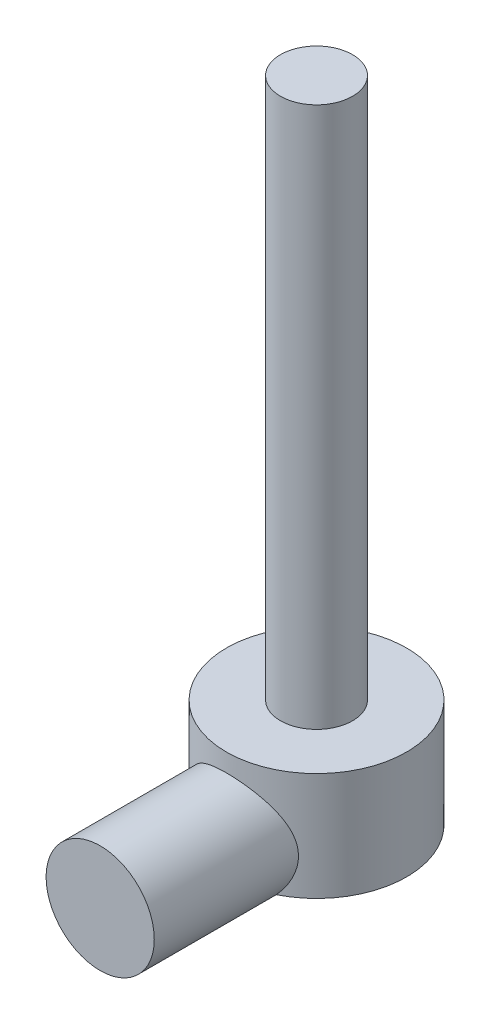
ISO-10303-21;
HEADER;
FILE_DESCRIPTION(('STEP AP214'),'2;1');
FILE_NAME('part.step','',(''),(''),'','','');
FILE_SCHEMA(('AUTOMOTIVE_DESIGN { 1 0 10303 214 1 1 1 1 }'));
ENDSEC;
DATA;
#1=APPLICATION_CONTEXT('core data for automotive mechanical design processes');
#2=APPLICATION_PROTOCOL_DEFINITION('international standard','automotive_design',2000,#1);
#3=PRODUCT_CONTEXT('',#1,'mechanical');
#4=PRODUCT('Part','Part','',(#3));
#5=PRODUCT_RELATED_PRODUCT_CATEGORY('part','',(#4));
#6=PRODUCT_DEFINITION_FORMATION('','',#4);
#7=PRODUCT_DEFINITION_CONTEXT('part definition',#1,'design');
#8=PRODUCT_DEFINITION('design','',#6,#7);
#9=PRODUCT_DEFINITION_SHAPE('','',#8);
#10=(LENGTH_UNIT() NAMED_UNIT(*) SI_UNIT(.MILLI.,.METRE.));
#11=(NAMED_UNIT(*) PLANE_ANGLE_UNIT() SI_UNIT($,.RADIAN.));
#12=(NAMED_UNIT(*) SI_UNIT($,.STERADIAN.) SOLID_ANGLE_UNIT());
#13=UNCERTAINTY_MEASURE_WITH_UNIT(LENGTH_MEASURE(1.E-05),#10,'distance_accuracy_value','');
#14=(GEOMETRIC_REPRESENTATION_CONTEXT(3) GLOBAL_UNCERTAINTY_ASSIGNED_CONTEXT((#13)) GLOBAL_UNIT_ASSIGNED_CONTEXT((#10,
#11,#12)) REPRESENTATION_CONTEXT('',''));
#15=CARTESIAN_POINT('',(0.,0.,0.));
#16=DIRECTION('',(0.,0.,1.));
#17=DIRECTION('',(1.,0.,0.));
#18=AXIS2_PLACEMENT_3D('',#15,#16,#17);
#19=CARTESIAN_POINT('',(0.,0.,120.));
#20=DIRECTION('',(0.,0.,-1.));
#21=DIRECTION('',(-1.,0.,0.));
#22=AXIS2_PLACEMENT_3D('',#19,#20,#21);
#23=CYLINDRICAL_SURFACE('',#22,30.);
#24=CARTESIAN_POINT('',(0.,0.,120.));
#25=DIRECTION('',(0.,0.,1.));
#26=DIRECTION('',(1.,0.,0.));
#27=AXIS2_PLACEMENT_3D('',#24,#25,#26);
#28=CIRCLE('',#27,30.);
#29=CARTESIAN_POINT('',(30.,0.,120.));
#30=VERTEX_POINT('',#29);
#31=EDGE_CURVE('E76',#30,#30,#28,.T.);
#32=ORIENTED_EDGE('',*,*,#31,.F.);
#33=EDGE_LOOP('',(#32));
#34=FACE_BOUND('',#33,.T.);
#35=DIRECTION('',(0.,0.,-1.));
#36=VECTOR('',#35,1.);
#37=CARTESIAN_POINT('',(22.3606797749983,-19.9999999999996,120.));
#38=LINE('',#37,#36);
#39=CARTESIAN_POINT('',(22.3606797749981,-19.9999999999998,44.7213595499958));
#40=VERTEX_POINT('',#39);
#41=CARTESIAN_POINT('',(22.3606797749979,-20.,0.));
#42=VERTEX_POINT('',#41);
#43=EDGE_CURVE('E61',#40,#42,#38,.T.);
#44=ORIENTED_EDGE('',*,*,#43,.F.);
#45=CARTESIAN_POINT('',(-30.,0.,40.));
#46=CARTESIAN_POINT('',(-30.0000054371733,-0.754773079428566,39.9999924355509));
#47=CARTESIAN_POINT('',(-29.9714752342614,-1.50948924622846,40.0214403954393));
#48=CARTESIAN_POINT('',(-29.8578998383123,-3.01222264616021,40.1062444493847));
#49=CARTESIAN_POINT('',(-29.7728584078095,-3.76024032191947,40.1695977533699));
#50=CARTESIAN_POINT('',(-29.5476372030003,-5.24413645995691,40.3355499097489));
#51=CARTESIAN_POINT('',(-29.4074070436577,-5.98000318745317,40.438184622088));
#52=CARTESIAN_POINT('',(-29.0739716563499,-7.43373400086842,40.6785728662394));
#53=CARTESIAN_POINT('',(-28.8807636589501,-8.15159714350205,40.8163282339694));
#54=CARTESIAN_POINT('',(-28.445531905068,-9.55986424580086,41.1208174466128));
#55=CARTESIAN_POINT('',(-28.2038804459786,-10.2504322497716,41.2873290187729));
#56=CARTESIAN_POINT('',(-27.6733374325038,-11.6067524308452,41.644790948041));
#57=CARTESIAN_POINT('',(-27.3844396594046,-12.2725013269922,41.835744521565));
#58=CARTESIAN_POINT('',(-26.9175218389557,-13.2505717076948,42.1364605134893));
#59=CARTESIAN_POINT('',(-26.756254628249,-13.5732271148505,42.2391003045646));
#60=CARTESIAN_POINT('',(-26.4228282782668,-14.211393473499,42.448473407424));
#61=CARTESIAN_POINT('',(-26.2506719799853,-14.5269062595888,42.5552056486378));
#62=CARTESIAN_POINT('',(-25.7181480386,-15.4626009873731,42.8806472634174));
#63=CARTESIAN_POINT('',(-25.3417344973462,-16.0719201724563,43.1045955804228));
#64=CARTESIAN_POINT('',(-24.499575785768,-17.3324425072036,43.5893887462093));
#65=CARTESIAN_POINT('',(-24.0285354757498,-17.9796546133088,43.8513964328546));
#66=CARTESIAN_POINT('',(-23.0373408991427,-19.233290460478,44.3801358051689));
#67=CARTESIAN_POINT('',(-22.5171838053726,-19.8397118501679,44.6468677620499));
#68=CARTESIAN_POINT('',(-21.4294452953906,-21.0099367523766,45.1790404761606));
#69=CARTESIAN_POINT('',(-20.8618305432127,-21.573709768574,45.4444801847928));
#70=CARTESIAN_POINT('',(-19.681488615426,-22.6556839826832,45.9679876279244));
#71=CARTESIAN_POINT('',(-19.0687591408844,-23.1738828552944,46.226054985816));
#72=CARTESIAN_POINT('',(-17.7316223686081,-24.2153507973842,46.756402146083));
#73=CARTESIAN_POINT('',(-17.0023054886216,-24.7330987799034,47.0271973104289));
#74=CARTESIAN_POINT('',(-15.4942685286804,-25.7047112154735,47.5453815754838));
#75=CARTESIAN_POINT('',(-14.715543968244,-26.158569862743,47.7927685483638));
#76=CARTESIAN_POINT('',(-13.1136665383534,-26.997192225111,48.2568802958076));
#77=CARTESIAN_POINT('',(-12.2905451657092,-27.3820041074603,48.4736264229593));
#78=CARTESIAN_POINT('',(-10.6050928823801,-28.0777989799474,48.8700418791931));
#79=CARTESIAN_POINT('',(-9.74276844298744,-28.3887941027499,49.0497173006522));
#80=CARTESIAN_POINT('',(-8.06989441005328,-28.9062031952632,49.3510766635054));
#81=CARTESIAN_POINT('',(-7.26225533212922,-29.1197644658465,49.4766580911895));
#82=CARTESIAN_POINT('',(-5.62706899055207,-29.4794276662173,49.6891894498778));
#83=CARTESIAN_POINT('',(-4.79952288403306,-29.6255335070595,49.776141620589));
#84=CARTESIAN_POINT('',(-3.13246717024248,-29.8478515838854,49.9087796773503));
#85=CARTESIAN_POINT('',(-2.29296745458029,-29.924118545397,49.9544978737899));
#86=CARTESIAN_POINT('',(-0.609322714269873,-30.0056462782551,50.0033768126455));
#87=CARTESIAN_POINT('',(0.234821829012559,-30.0109142739014,50.0065418849348));
#88=CARTESIAN_POINT('',(1.8148952998179,-29.95415500019,49.972503343435));
#89=CARTESIAN_POINT('',(2.55124667795303,-29.9004022371462,49.9402633154868));
#90=CARTESIAN_POINT('',(4.01585794086055,-29.739124395353,49.8438693758084));
#91=CARTESIAN_POINT('',(4.74411865138391,-29.6316048566647,49.7797187521095));
#92=CARTESIAN_POINT('',(6.18756243161355,-29.3641437085351,49.6209771651271));
#93=CARTESIAN_POINT('',(6.90274503157528,-29.20420022,49.5263851106975));
#94=CARTESIAN_POINT('',(8.31547959196039,-28.8337670024337,49.3088598139462));
#95=CARTESIAN_POINT('',(9.01303082461762,-28.6232751906837,49.185925403856));
#96=CARTESIAN_POINT('',(10.3904072750655,-28.1526581576168,48.9135476146463));
#97=CARTESIAN_POINT('',(11.0701088227145,-27.8922569228414,48.7639571594242));
#98=CARTESIAN_POINT('',(12.4041910107697,-27.3251067169327,48.4417898277111));
#99=CARTESIAN_POINT('',(13.0585718889383,-27.0183581811358,48.2692131671294));
#100=CARTESIAN_POINT('',(14.3392870539587,-26.3610135406394,47.9043659781245));
#101=CARTESIAN_POINT('',(14.9656174396906,-26.0104113625566,47.7120927225474));
#102=CARTESIAN_POINT('',(16.1878487666349,-25.2678641870583,47.3113861831584));
#103=CARTESIAN_POINT('',(16.783747796732,-24.8759165978422,47.1029518864842));
#104=CARTESIAN_POINT('',(18.0124884902317,-24.0038251222862,46.6479274519126));
#105=CARTESIAN_POINT('',(18.6412397419404,-23.5187386533106,46.3997536842666));
#106=CARTESIAN_POINT('',(19.8559772510624,-22.502607304962,45.8930644751574));
#107=CARTESIAN_POINT('',(20.4419605571017,-21.9715592593429,45.6345483218784));
#108=CARTESIAN_POINT('',(21.569887598821,-20.8653945949799,45.1123778800077));
#109=CARTESIAN_POINT('',(22.1117741531459,-20.2902225786288,44.8487174528414));
#110=CARTESIAN_POINT('',(23.1487409834838,-19.0986815642022,44.3223864406097));
#111=CARTESIAN_POINT('',(23.6438190972658,-18.4823106652618,44.0597159018081));
#112=CARTESIAN_POINT('',(24.6397506704863,-17.1365792062999,43.5114023855333));
#113=CARTESIAN_POINT('',(25.134607075518,-16.4024071704545,43.2266309181986));
#114=CARTESIAN_POINT('',(26.060187845091,-14.8880542042171,42.6750161739419));
#115=CARTESIAN_POINT('',(26.4909016641373,-14.1078657377691,42.4081758489753));
#116=CARTESIAN_POINT('',(27.2835991057643,-12.5060980569954,41.9025771259453));
#117=CARTESIAN_POINT('',(27.6456857193192,-11.6845832451744,41.663776855557));
#118=CARTESIAN_POINT('',(28.2973336841537,-10.0036296959614,41.2239700066492));
#119=CARTESIAN_POINT('',(28.586923525734,-9.14420601293802,41.0229485892923));
#120=CARTESIAN_POINT('',(29.0266922229524,-7.61055439517445,40.7124607158075));
#121=CARTESIAN_POINT('',(29.1936352760004,-6.94318574540928,40.5926498926779));
#122=CARTESIAN_POINT('',(29.4819157838905,-5.59394741557897,40.3837646228614));
#123=CARTESIAN_POINT('',(29.6032605207762,-4.91208006934634,40.2946852685502));
#124=CARTESIAN_POINT('',(29.7986252970483,-3.53871644845569,40.1504262123343));
#125=CARTESIAN_POINT('',(29.8726922198134,-2.84723040991902,40.0952129290315));
#126=CARTESIAN_POINT('',(29.9725913229736,-1.45881623193733,40.0205909917451));
#127=CARTESIAN_POINT('',(29.9984224804208,-0.76188797739262,40.0011830970955));
#128=CARTESIAN_POINT('',(30.001439292512,0.633092969562069,39.9989205730711));
#129=CARTESIAN_POINT('',(29.9785579814936,1.33114588996814,40.016116263115));
#130=CARTESIAN_POINT('',(29.8843768935634,2.72212786656803,40.0864993514701));
#131=CARTESIAN_POINT('',(29.8130768644567,3.41505689605443,40.1396869372494));
#132=CARTESIAN_POINT('',(29.6230684849219,4.7913202770706,40.2801155116223));
#133=CARTESIAN_POINT('',(29.5043282866804,5.47464786325118,40.3673793756117));
#134=CARTESIAN_POINT('',(29.2210546703214,6.82695351863888,40.5729035284754));
#135=CARTESIAN_POINT('',(29.0565199657639,7.4959311841654,40.6911646881071));
#136=CARTESIAN_POINT('',(28.6838971255832,8.81493130388344,40.9546817127304));
#137=CARTESIAN_POINT('',(28.4758792783311,9.46498244311765,41.099893970628));
#138=CARTESIAN_POINT('',(28.0180764187168,10.7447421919885,41.4133350881076));
#139=CARTESIAN_POINT('',(27.7682746224651,11.3744425052817,41.5815731918175));
#140=CARTESIAN_POINT('',(27.2288911048792,12.6112149171688,41.9367586997092));
#141=CARTESIAN_POINT('',(26.9393018498846,13.2182827026054,42.1237096452986));
#142=CARTESIAN_POINT('',(26.3223000055147,14.4078239321894,42.5119906697039));
#143=CARTESIAN_POINT('',(25.9948971032765,14.9903036233565,42.713317060781));
#144=CARTESIAN_POINT('',(25.2414085206861,16.2323716245478,43.1636078905243));
#145=CARTESIAN_POINT('',(24.8081780488878,16.8868967379914,43.4146109863377));
#146=CARTESIAN_POINT('',(23.8934940052002,18.1580335537829,43.9246536038001));
#147=CARTESIAN_POINT('',(23.4120360691993,18.7746418168658,44.1836938512658));
#148=CARTESIAN_POINT('',(22.4025038732755,19.9684598947072,44.7040326920284));
#149=CARTESIAN_POINT('',(21.8743891519663,20.5456347277241,44.9653330646558));
#150=CARTESIAN_POINT('',(20.7737943393439,21.6578301169655,45.4842796758364));
#151=CARTESIAN_POINT('',(20.2013119528565,22.1928484895119,45.7419257245318));
#152=CARTESIAN_POINT('',(18.9364779766343,23.2851001855273,46.2811171660541));
#153=CARTESIAN_POINT('',(18.2382257014387,23.8361500707667,46.5614043507671));
#154=CARTESIAN_POINT('',(16.7904682073809,24.8772013130106,47.1028396436448));
#155=CARTESIAN_POINT('',(16.0409577545394,25.367196421245,47.3639857916584));
#156=CARTESIAN_POINT('',(14.4948690885772,26.281262214501,47.8597679650152));
#157=CARTESIAN_POINT('',(13.6983136253921,26.7053644094267,48.0944166466546));
#158=CARTESIAN_POINT('',(12.0627242110709,27.4829085808844,48.5304710877413));
#159=CARTESIAN_POINT('',(11.2236960707639,27.8363601907911,48.7318813786679));
#160=CARTESIAN_POINT('',(9.57163089673216,28.4447091895007,49.082015436901));
#161=CARTESIAN_POINT('',(8.76112996669411,28.7048990218314,49.2335028420041));
#162=CARTESIAN_POINT('',(7.11503534150895,29.1565507968783,49.4981910314827));
#163=CARTESIAN_POINT('',(6.27944258101489,29.3480152961319,49.6113932400334));
#164=CARTESIAN_POINT('',(4.59121918613496,29.6590072808808,49.7959943798631));
#165=CARTESIAN_POINT('',(3.73860538410503,29.7786025195841,49.8674326814404));
#166=CARTESIAN_POINT('',(2.02375863082274,29.9440494730322,49.9664050743554));
#167=CARTESIAN_POINT('',(1.16152694827898,29.989910800952,49.9939448890236));
#168=CARTESIAN_POINT('',(-0.448638369596429,30.0059636845279,50.0035796163061));
#169=CARTESIAN_POINT('',(-1.19646649879256,29.9854383726646,49.9912497430117));
#170=CARTESIAN_POINT('',(-2.6871570185605,29.8887419424398,49.9333091422451));
#171=CARTESIAN_POINT('',(-3.43001993824535,29.8125768518574,49.8877020198904));
#172=CARTESIAN_POINT('',(-4.90534527411014,29.6056163790939,49.7643009048837));
#173=CARTESIAN_POINT('',(-5.63780776281637,29.4748213780623,49.6865071367957));
#174=CARTESIAN_POINT('',(-7.08732236988179,29.160245460038,49.5005437474304));
#175=CARTESIAN_POINT('',(-7.80437402569053,28.9764629550249,49.3923732157726));
#176=CARTESIAN_POINT('',(-9.20713596965784,28.5614260115334,49.1500473875608));
#177=CARTESIAN_POINT('',(-9.89316522831643,28.3309850756384,49.0163393490527));
#178=CARTESIAN_POINT('',(-11.242249514208,27.8232155122072,48.7246154429873));
#179=CARTESIAN_POINT('',(-11.9053051081935,27.5458880423398,48.5666001756051));
#180=CARTESIAN_POINT('',(-13.2054545723106,26.946769704929,48.2293178600433));
#181=CARTESIAN_POINT('',(-13.8425455868989,26.6249739638318,48.0500484828002));
#182=CARTESIAN_POINT('',(-15.0881846024373,25.9393946780803,47.6735789595604));
#183=CARTESIAN_POINT('',(-15.6967308045441,25.5756084922492,47.4763776858224));
#184=CARTESIAN_POINT('',(-16.9476190424841,24.7667424868672,47.0453184951054));
#185=CARTESIAN_POINT('',(-17.5864585689585,24.317124761882,46.8098051726832));
#186=CARTESIAN_POINT('',(-18.8241654588664,23.3721450786188,46.3259369348329));
#187=CARTESIAN_POINT('',(-19.4230304625739,22.876780423972,46.0775812628444));
#188=CARTESIAN_POINT('',(-20.5793876993337,21.8424161446594,45.5728772295248));
#189=CARTESIAN_POINT('',(-21.1368376378641,21.3033730570058,45.3165210670253));
#190=CARTESIAN_POINT('',(-22.2078589213948,20.1844237054672,44.8013865884644));
#191=CARTESIAN_POINT('',(-22.7214277151681,19.6045150692523,44.5426081325413));
#192=CARTESIAN_POINT('',(-23.7652386100365,18.329631573187,43.9954895932491));
#193=CARTESIAN_POINT('',(-24.2893195038196,17.6293953373685,43.7075675480208));
#194=CARTESIAN_POINT('',(-25.0295083694434,16.5443485377289,43.2851540783708));
#195=CARTESIAN_POINT('',(-25.2686007562634,16.1768518277079,43.1459165421274));
#196=CARTESIAN_POINT('',(-25.731195664513,15.4304379178484,42.8716442524079));
#197=CARTESIAN_POINT('',(-25.9546924020116,15.0515165547962,42.7366110683664));
#198=CARTESIAN_POINT('',(-26.6007590168042,13.8987545541486,42.3397557549875));
#199=CARTESIAN_POINT('',(-26.999246247833,13.1084169941735,42.0859808338298));
#200=CARTESIAN_POINT('',(-27.7276182166738,11.4877271374779,41.6097198076573));
#201=CARTESIAN_POINT('',(-28.0575206168377,10.6573852109228,41.3872256518336));
#202=CARTESIAN_POINT('',(-28.4850286249539,9.4218729808165,41.0929389990196));
#203=CARTESIAN_POINT('',(-28.6115719641199,9.03038758470866,41.0048657325039));
#204=CARTESIAN_POINT('',(-28.8489055913011,8.24078837678754,40.8382373313778));
#205=CARTESIAN_POINT('',(-28.9596998522838,7.84267626508383,40.7596797970072));
#206=CARTESIAN_POINT('',(-29.2678307379545,6.63922693192671,40.5395886546573));
#207=CARTESIAN_POINT('',(-29.440976404297,5.82460119453229,40.4135940279387));
#208=CARTESIAN_POINT('',(-29.7191257226127,4.17951386891393,40.209493955114));
#209=CARTESIAN_POINT('',(-29.8242560556143,3.34908470349393,40.1312994945306));
#210=CARTESIAN_POINT('',(-29.9646857763522,1.67907944636471,40.0265599738778));
#211=CARTESIAN_POINT('',(-29.9999939524452,0.839504519189613,40.0000084136404));
#212=CARTESIAN_POINT('',(-30.,0.,40.));
#213=B_SPLINE_CURVE_WITH_KNOTS('',3,(#45,#46,#47,#48,#49,#50,#51,#52,#53,#54,#55,#56,#57,#58,
#59,#60,#61,#62,#63,#64,#65,#66,#67,#68,#69,#70,#71,#72,#73,#74,#75,#76,#77,#78,#79,#80,#81,#82,
#83,#84,#85,#86,#87,#88,#89,#90,#91,#92,#93,#94,#95,#96,#97,#98,#99,#100,#101,#102,#103,#104,
#105,#106,#107,#108,#109,#110,#111,#112,#113,#114,#115,#116,#117,#118,#119,#120,#121,#122,#123,
#124,#125,#126,#127,#128,#129,#130,#131,#132,#133,#134,#135,#136,#137,#138,#139,#140,#141,#142,
#143,#144,#145,#146,#147,#148,#149,#150,#151,#152,#153,#154,#155,#156,#157,#158,#159,#160,#161,
#162,#163,#164,#165,#166,#167,#168,#169,#170,#171,#172,#173,#174,#175,#176,#177,#178,#179,#180,
#181,#182,#183,#184,#185,#186,#187,#188,#189,#190,#191,#192,#193,#194,#195,#196,#197,#198,#199,
#200,#201,#202,#203,#204,#205,#206,#207,#208,#209,#210,#211,#212),.UNSPECIFIED.,.T.,.F.,(4,2,2,
2,2,2,2,2,2,2,2,2,2,2,2,2,2,2,2,2,2,2,2,2,2,2,2,2,2,2,2,2,2,2,2,2,2,2,2,2,2,2,2,2,2,2,2,2,2,2,2,
2,2,2,2,2,2,2,2,2,2,2,2,2,2,2,2,2,2,2,2,2,2,2,2,2,2,2,2,2,2,2,2,4),(0.,2.26339065976523,
4.52663063739907,6.7919416710331,9.05737114715355,11.3060153718576,13.5549558090047,
14.6798398054329,15.8044315174353,18.0536808444331,20.578006829107,23.1024782036475,
25.6287380005963,28.1551266186056,30.9549413508711,33.7550103451904,36.5531183427491,
39.3507661189213,41.8814765390892,44.4120402106454,46.9406192393127,49.4689409776018,
51.6833334117911,53.8974977247652,56.1117414113421,58.3260763460167,60.5530302662239,
62.7799632701391,65.0072050288865,67.2345864887666,69.7280443332067,72.2216740863463,
74.71848750613,77.2154162053875,80.002108172649,82.7892577871951,85.5721909336379,
88.3540287001651,90.4467811706651,92.5391992867497,94.6295392047498,96.7199234526042,
98.8131832342802,100.906453919041,103.001132238211,105.095869406138,107.187246361405,
109.279465412906,111.372081168463,113.46416201983,115.933925800171,118.403913272112,
120.876064180349,123.348343060374,126.142642921312,128.937228535818,131.730473642596,
134.523337623591,137.113418055671,139.703402128459,142.290940703078,144.878141895905,
147.120010063233,149.361635392023,151.603245081396,153.844921958156,156.050442084091,
158.25590776179,160.461615342147,162.667461736035,165.112763633141,167.558209750834,
170.006119860739,172.454172194157,175.21302745175,176.592687183034,177.972855896356,
180.731292892543,183.489018638118,184.750877047949,186.012416565873,188.534926127152,
191.052723792891,193.57020452896),.UNSPECIFIED.);
#214=CARTESIAN_POINT('',(-22.3606797749983,-20.,44.7213595499957));
#215=VERTEX_POINT('',#214);
#216=EDGE_CURVE('E45',#40,#215,#213,.T.);
#217=ORIENTED_EDGE('',*,*,#216,.T.);
#218=DIRECTION('',(0.,0.,-1.));
#219=VECTOR('',#218,1.);
#220=CARTESIAN_POINT('',(-22.3606797749983,-19.9999999999996,120.));
#221=LINE('',#220,#219);
#222=CARTESIAN_POINT('',(-22.3606797749979,-20.,0.));
#223=VERTEX_POINT('',#222);
#224=EDGE_CURVE('E78',#223,#215,#221,.F.);
#225=ORIENTED_EDGE('',*,*,#224,.F.);
#226=CARTESIAN_POINT('',(0.,0.,0.));
#227=DIRECTION('',(0.,0.,1.));
#228=DIRECTION('',(1.,0.,0.));
#229=AXIS2_PLACEMENT_3D('',#226,#227,#228);
#230=CIRCLE('',#229,30.);
#231=EDGE_CURVE('E72',#223,#42,#230,.T.);
#232=ORIENTED_EDGE('',*,*,#231,.T.);
#233=EDGE_LOOP('',(#44,#217,#225,#232));
#234=FACE_BOUND('',#233,.T.);
#235=ADVANCED_FACE('F41',(#34,#234),#23,.T.);
#236=CARTESIAN_POINT('',(0.,0.,0.));
#237=DIRECTION('',(0.,0.,1.));
#238=DIRECTION('',(1.,0.,0.));
#239=AXIS2_PLACEMENT_3D('',#236,#237,#238);
#240=PLANE('',#239);
#241=DIRECTION('',(-1.,0.,0.));
#242=VECTOR('',#241,1.);
#243=CARTESIAN_POINT('',(0.,-20.,0.));
#244=LINE('',#243,#242);
#245=EDGE_CURVE('E75',#42,#223,#244,.T.);
#246=ORIENTED_EDGE('',*,*,#245,.F.);
#247=ORIENTED_EDGE('',*,*,#231,.F.);
#248=EDGE_LOOP('',(#246,#247));
#249=FACE_BOUND('',#248,.T.);
#250=ADVANCED_FACE('F73',(#249),#240,.F.);
#251=CARTESIAN_POINT('',(0.,0.,120.));
#252=DIRECTION('',(0.,0.,1.));
#253=DIRECTION('',(1.,0.,0.));
#254=AXIS2_PLACEMENT_3D('',#251,#252,#253);
#255=PLANE('',#254);
#256=ORIENTED_EDGE('',*,*,#31,.T.);
#257=EDGE_LOOP('',(#256));
#258=FACE_BOUND('',#257,.T.);
#259=ADVANCED_FACE('F114',(#258),#255,.T.);
#260=CARTESIAN_POINT('',(0.,-20.,0.));
#261=DIRECTION('',(0.,1.,0.));
#262=DIRECTION('',(0.,0.,1.));
#263=AXIS2_PLACEMENT_3D('',#260,#261,#262);
#264=CYLINDRICAL_SURFACE('',#263,50.);
#265=CARTESIAN_POINT('',(0.,40.,-1.39659253553725E-13));
#266=DIRECTION('',(0.,1.,0.));
#267=DIRECTION('',(0.,0.,1.));
#268=AXIS2_PLACEMENT_3D('',#265,#266,#267);
#269=CIRCLE('',#268,50.);
#270=CARTESIAN_POINT('',(0.,40.0000000000002,49.9999999999999));
#271=VERTEX_POINT('',#270);
#272=EDGE_CURVE('E90',#271,#271,#269,.T.);
#273=ORIENTED_EDGE('',*,*,#272,.F.);
#274=EDGE_LOOP('',(#273));
#275=FACE_BOUND('',#274,.T.);
#276=ORIENTED_EDGE('',*,*,#216,.F.);
#277=CARTESIAN_POINT('',(0.,-20.,0.));
#278=DIRECTION('',(0.,1.,0.));
#279=DIRECTION('',(0.,0.,1.));
#280=AXIS2_PLACEMENT_3D('',#277,#278,#279);
#281=CIRCLE('',#280,50.);
#282=EDGE_CURVE('E82',#40,#215,#281,.T.);
#283=ORIENTED_EDGE('',*,*,#282,.T.);
#284=EDGE_LOOP('',(#276,#283));
#285=FACE_BOUND('',#284,.T.);
#286=ADVANCED_FACE('F111',(#275,#285),#264,.T.);
#287=CARTESIAN_POINT('',(0.,-20.,0.));
#288=DIRECTION('',(0.,1.,0.));
#289=DIRECTION('',(0.,0.,1.));
#290=AXIS2_PLACEMENT_3D('',#287,#288,#289);
#291=PLANE('',#290);
#292=ORIENTED_EDGE('',*,*,#282,.F.);
#293=ORIENTED_EDGE('',*,*,#43,.T.);
#294=ORIENTED_EDGE('',*,*,#245,.T.);
#295=ORIENTED_EDGE('',*,*,#224,.T.);
#296=EDGE_LOOP('',(#292,#293,#294,#295));
#297=FACE_BOUND('',#296,.T.);
#298=ADVANCED_FACE('F84',(#297),#291,.F.);
#299=CARTESIAN_POINT('',(0.,40.,-1.39659253553725E-13));
#300=DIRECTION('',(0.,1.,0.));
#301=DIRECTION('',(0.,0.,1.));
#302=AXIS2_PLACEMENT_3D('',#299,#300,#301);
#303=PLANE('',#302);
#304=CARTESIAN_POINT('',(0.,40.,-1.39659253553725E-13));
#305=DIRECTION('',(0.,1.,0.));
#306=DIRECTION('',(0.,0.,1.));
#307=AXIS2_PLACEMENT_3D('',#304,#305,#306);
#308=CIRCLE('',#307,20.);
#309=CARTESIAN_POINT('',(0.,40.0000000000001,19.9999999999999));
#310=VERTEX_POINT('',#309);
#311=EDGE_CURVE('E11',#310,#310,#308,.T.);
#312=ORIENTED_EDGE('',*,*,#311,.F.);
#313=EDGE_LOOP('',(#312));
#314=FACE_BOUND('',#313,.T.);
#315=ORIENTED_EDGE('',*,*,#272,.T.);
#316=EDGE_LOOP('',(#315));
#317=FACE_BOUND('',#316,.T.);
#318=ADVANCED_FACE('F102',(#314,#317),#303,.T.);
#319=CARTESIAN_POINT('',(0.,340.,-1.18710365520667E-12));
#320=DIRECTION('',(0.,-1.,0.));
#321=DIRECTION('',(0.,0.,-1.));
#322=AXIS2_PLACEMENT_3D('',#319,#320,#321);
#323=CYLINDRICAL_SURFACE('',#322,20.);
#324=CARTESIAN_POINT('',(0.,340.,-1.18710365520667E-12));
#325=DIRECTION('',(0.,1.,0.));
#326=DIRECTION('',(0.,0.,1.));
#327=AXIS2_PLACEMENT_3D('',#324,#325,#326);
#328=CIRCLE('',#327,20.);
#329=CARTESIAN_POINT('',(0.,340.,19.9999999999988));
#330=VERTEX_POINT('',#329);
#331=EDGE_CURVE('E92',#330,#330,#328,.T.);
#332=ORIENTED_EDGE('',*,*,#331,.F.);
#333=EDGE_LOOP('',(#332));
#334=FACE_BOUND('',#333,.T.);
#335=ORIENTED_EDGE('',*,*,#311,.T.);
#336=EDGE_LOOP('',(#335));
#337=FACE_BOUND('',#336,.T.);
#338=ADVANCED_FACE('F99',(#334,#337),#323,.T.);
#339=CARTESIAN_POINT('',(0.,340.,-1.18710365520667E-12));
#340=DIRECTION('',(0.,1.,0.));
#341=DIRECTION('',(0.,0.,1.));
#342=AXIS2_PLACEMENT_3D('',#339,#340,#341);
#343=PLANE('',#342);
#344=ORIENTED_EDGE('',*,*,#331,.T.);
#345=EDGE_LOOP('',(#344));
#346=FACE_BOUND('',#345,.T.);
#347=ADVANCED_FACE('F97',(#346),#343,.T.);
#348=CLOSED_SHELL('',(#235,#250,#259,#286,#298,#318,#338,#347));
#349=MANIFOLD_SOLID_BREP('B2',#348);
#350=ADVANCED_BREP_SHAPE_REPRESENTATION('',(#18,#349),#14);
#351=SHAPE_DEFINITION_REPRESENTATION(#9,#350);
ENDSEC;
END-ISO-10303-21;
